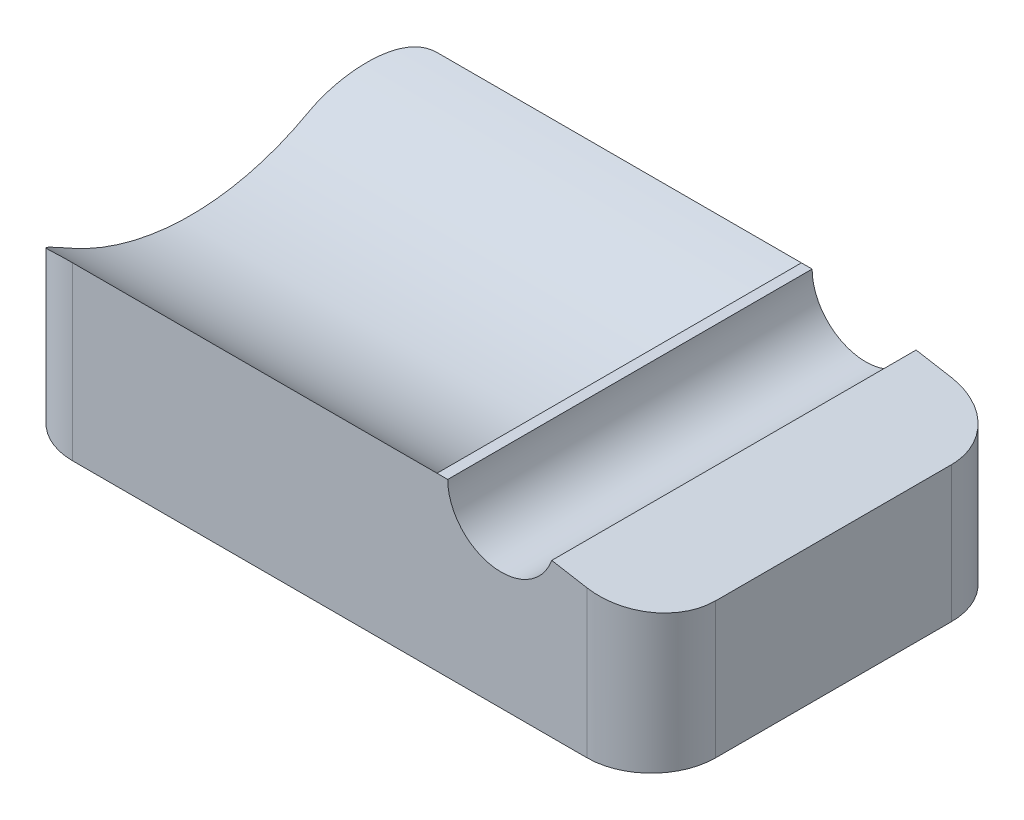
ISO-10303-21;
HEADER;
FILE_DESCRIPTION(('STEP AP214'),'2;1');
FILE_NAME('part.step','',(''),(''),'','','');
FILE_SCHEMA(('AUTOMOTIVE_DESIGN { 1 0 10303 214 1 1 1 1 }'));
ENDSEC;
DATA;
#1=APPLICATION_CONTEXT('core data for automotive mechanical design processes');
#2=APPLICATION_PROTOCOL_DEFINITION('international standard','automotive_design',2000,#1);
#3=PRODUCT_CONTEXT('',#1,'mechanical');
#4=PRODUCT('Part','Part','',(#3));
#5=PRODUCT_RELATED_PRODUCT_CATEGORY('part','',(#4));
#6=PRODUCT_DEFINITION_FORMATION('','',#4);
#7=PRODUCT_DEFINITION_CONTEXT('part definition',#1,'design');
#8=PRODUCT_DEFINITION('design','',#6,#7);
#9=PRODUCT_DEFINITION_SHAPE('','',#8);
#10=(LENGTH_UNIT() NAMED_UNIT(*) SI_UNIT(.MILLI.,.METRE.));
#11=(NAMED_UNIT(*) PLANE_ANGLE_UNIT() SI_UNIT($,.RADIAN.));
#12=(NAMED_UNIT(*) SI_UNIT($,.STERADIAN.) SOLID_ANGLE_UNIT());
#13=UNCERTAINTY_MEASURE_WITH_UNIT(LENGTH_MEASURE(1.E-05),#10,'distance_accuracy_value','');
#14=(GEOMETRIC_REPRESENTATION_CONTEXT(3) GLOBAL_UNCERTAINTY_ASSIGNED_CONTEXT((#13)) GLOBAL_UNIT_ASSIGNED_CONTEXT((#10,
#11,#12)) REPRESENTATION_CONTEXT('',''));
#15=CARTESIAN_POINT('',(0.,0.,0.));
#16=DIRECTION('',(0.,0.,1.));
#17=DIRECTION('',(1.,0.,0.));
#18=AXIS2_PLACEMENT_3D('',#15,#16,#17);
#19=CARTESIAN_POINT('',(0.,0.,0.));
#20=DIRECTION('',(0.,-1.,0.));
#21=DIRECTION('',(0.,0.,-1.));
#22=AXIS2_PLACEMENT_3D('',#19,#20,#21);
#23=PLANE('',#22);
#24=DIRECTION('',(0.,0.,1.));
#25=VECTOR('',#24,1.);
#26=CARTESIAN_POINT('',(0.,0.,0.));
#27=LINE('',#26,#25);
#28=CARTESIAN_POINT('',(0.,0.,-28.));
#29=VERTEX_POINT('',#28);
#30=CARTESIAN_POINT('',(0.,0.,-6.));
#31=VERTEX_POINT('',#30);
#32=EDGE_CURVE('E215',#29,#31,#27,.T.);
#33=ORIENTED_EDGE('',*,*,#32,.F.);
#34=CARTESIAN_POINT('',(6.,0.,-28.));
#35=DIRECTION('',(0.,-1.,0.));
#36=DIRECTION('',(0.,0.,-1.));
#37=AXIS2_PLACEMENT_3D('',#34,#35,#36);
#38=CIRCLE('',#37,6.);
#39=CARTESIAN_POINT('',(6.,0.,-34.));
#40=VERTEX_POINT('',#39);
#41=EDGE_CURVE('E266',#29,#40,#38,.T.);
#42=ORIENTED_EDGE('',*,*,#41,.T.);
#43=DIRECTION('',(-1.,0.,0.));
#44=VECTOR('',#43,1.);
#45=CARTESIAN_POINT('',(0.,0.,-34.));
#46=LINE('',#45,#44);
#47=CARTESIAN_POINT('',(54.,0.,-34.));
#48=VERTEX_POINT('',#47);
#49=EDGE_CURVE('E239',#48,#40,#46,.T.);
#50=ORIENTED_EDGE('',*,*,#49,.F.);
#51=CARTESIAN_POINT('',(54.,0.,-28.));
#52=DIRECTION('',(0.,-1.,0.));
#53=DIRECTION('',(0.,0.,-1.));
#54=AXIS2_PLACEMENT_3D('',#51,#52,#53);
#55=CIRCLE('',#54,6.);
#56=CARTESIAN_POINT('',(60.,0.,-28.));
#57=VERTEX_POINT('',#56);
#58=EDGE_CURVE('E263',#48,#57,#55,.T.);
#59=ORIENTED_EDGE('',*,*,#58,.T.);
#60=DIRECTION('',(0.,0.,-1.));
#61=VECTOR('',#60,1.);
#62=CARTESIAN_POINT('',(60.,0.,0.));
#63=LINE('',#62,#61);
#64=CARTESIAN_POINT('',(60.,0.,-6.));
#65=VERTEX_POINT('',#64);
#66=EDGE_CURVE('E235',#65,#57,#63,.T.);
#67=ORIENTED_EDGE('',*,*,#66,.F.);
#68=CARTESIAN_POINT('',(54.,0.,-6.));
#69=DIRECTION('',(0.,-1.,0.));
#70=DIRECTION('',(0.,0.,-1.));
#71=AXIS2_PLACEMENT_3D('',#68,#69,#70);
#72=CIRCLE('',#71,6.);
#73=CARTESIAN_POINT('',(54.,0.,0.));
#74=VERTEX_POINT('',#73);
#75=EDGE_CURVE('E260',#65,#74,#72,.T.);
#76=ORIENTED_EDGE('',*,*,#75,.T.);
#77=DIRECTION('',(1.,0.,0.));
#78=VECTOR('',#77,1.);
#79=CARTESIAN_POINT('',(0.,0.,0.));
#80=LINE('',#79,#78);
#81=CARTESIAN_POINT('',(6.,0.,0.));
#82=VERTEX_POINT('',#81);
#83=EDGE_CURVE('E231',#82,#74,#80,.T.);
#84=ORIENTED_EDGE('',*,*,#83,.F.);
#85=CARTESIAN_POINT('',(6.,0.,-6.));
#86=DIRECTION('',(0.,-1.,0.));
#87=DIRECTION('',(0.,0.,-1.));
#88=AXIS2_PLACEMENT_3D('',#85,#86,#87);
#89=CIRCLE('',#88,6.);
#90=EDGE_CURVE('E257',#82,#31,#89,.T.);
#91=ORIENTED_EDGE('',*,*,#90,.T.);
#92=EDGE_LOOP('',(#33,#42,#50,#59,#67,#76,#84,#91));
#93=FACE_BOUND('',#92,.T.);
#94=CARTESIAN_POINT('',(14.5,0.,-17.));
#95=DIRECTION('',(0.,-1.,0.));
#96=DIRECTION('',(0.,0.,1.));
#97=AXIS2_PLACEMENT_3D('',#94,#95,#96);
#98=CIRCLE('',#97,6.5);
#99=CARTESIAN_POINT('',(12.,0.,-11.));
#100=VERTEX_POINT('',#99);
#101=CARTESIAN_POINT('',(12.,0.,-23.));
#102=VERTEX_POINT('',#101);
#103=EDGE_CURVE('E521',#100,#102,#98,.T.);
#104=ORIENTED_EDGE('',*,*,#103,.F.);
#105=DIRECTION('',(-1.,0.,0.));
#106=VECTOR('',#105,1.);
#107=CARTESIAN_POINT('',(12.,0.,-11.));
#108=LINE('',#107,#106);
#109=CARTESIAN_POINT('',(13.,0.,-11.));
#110=VERTEX_POINT('',#109);
#111=EDGE_CURVE('E178',#110,#100,#108,.T.);
#112=ORIENTED_EDGE('',*,*,#111,.F.);
#113=DIRECTION('',(0.,0.,1.));
#114=VECTOR('',#113,1.);
#115=CARTESIAN_POINT('',(13.,0.,-11.));
#116=LINE('',#115,#114);
#117=CARTESIAN_POINT('',(13.,0.,-23.));
#118=VERTEX_POINT('',#117);
#119=EDGE_CURVE('E174',#118,#110,#116,.T.);
#120=ORIENTED_EDGE('',*,*,#119,.F.);
#121=DIRECTION('',(1.,0.,0.));
#122=VECTOR('',#121,1.);
#123=CARTESIAN_POINT('',(13.,0.,-23.));
#124=LINE('',#123,#122);
#125=EDGE_CURVE('E517',#102,#118,#124,.T.);
#126=ORIENTED_EDGE('',*,*,#125,.F.);
#127=EDGE_LOOP('',(#104,#112,#120,#126));
#128=FACE_BOUND('',#127,.T.);
#129=ADVANCED_FACE('F45',(#93,#128),#23,.T.);
#130=CARTESIAN_POINT('',(0.,16.,0.));
#131=DIRECTION('',(0.,-1.,0.));
#132=DIRECTION('',(0.,0.,-1.));
#133=AXIS2_PLACEMENT_3D('',#130,#131,#132);
#134=PLANE('',#133);
#135=DIRECTION('',(1.,0.,0.));
#136=VECTOR('',#135,1.);
#137=CARTESIAN_POINT('',(0.,16.,0.));
#138=LINE('',#137,#136);
#139=CARTESIAN_POINT('',(40.,16.,0.));
#140=VERTEX_POINT('',#139);
#141=CARTESIAN_POINT('',(41.,16.,0.));
#142=VERTEX_POINT('',#141);
#143=EDGE_CURVE('E223',#140,#142,#138,.T.);
#144=ORIENTED_EDGE('',*,*,#143,.T.);
#145=DIRECTION('',(0.,0.,1.));
#146=VECTOR('',#145,1.);
#147=CARTESIAN_POINT('',(41.,16.,-34.));
#148=LINE('',#147,#146);
#149=CARTESIAN_POINT('',(41.,16.,-34.));
#150=VERTEX_POINT('',#149);
#151=EDGE_CURVE('E206',#142,#150,#148,.F.);
#152=ORIENTED_EDGE('',*,*,#151,.T.);
#153=DIRECTION('',(-1.,0.,0.));
#154=VECTOR('',#153,1.);
#155=CARTESIAN_POINT('',(0.,16.,-34.));
#156=LINE('',#155,#154);
#157=CARTESIAN_POINT('',(40.,16.,-34.));
#158=VERTEX_POINT('',#157);
#159=EDGE_CURVE('E224',#150,#158,#156,.T.);
#160=ORIENTED_EDGE('',*,*,#159,.T.);
#161=DIRECTION('',(0.,0.,-1.));
#162=VECTOR('',#161,1.);
#163=CARTESIAN_POINT('',(40.,16.,0.));
#164=LINE('',#163,#162);
#165=EDGE_CURVE('E227',#140,#158,#164,.T.);
#166=ORIENTED_EDGE('',*,*,#165,.F.);
#167=EDGE_LOOP('',(#144,#152,#160,#166));
#168=FACE_BOUND('',#167,.T.);
#169=ADVANCED_FACE('F299',(#168),#134,.F.);
#170=CARTESIAN_POINT('',(0.,16.,0.));
#171=DIRECTION('',(1.,0.,0.));
#172=DIRECTION('',(0.,0.,-1.));
#173=AXIS2_PLACEMENT_3D('',#170,#171,#172);
#174=PLANE('',#173);
#175=CARTESIAN_POINT('',(0.,31.,-17.));
#176=DIRECTION('',(-1.,0.,0.));
#177=DIRECTION('',(0.,0.,1.));
#178=AXIS2_PLACEMENT_3D('',#175,#176,#177);
#179=CIRCLE('',#178,22.6715680975093);
#180=CARTESIAN_POINT('',(0.,11.175772398401,-28.));
#181=VERTEX_POINT('',#180);
#182=CARTESIAN_POINT('',(0.,11.175772398401,-6.));
#183=VERTEX_POINT('',#182);
#184=EDGE_CURVE('E210',#181,#183,#179,.T.);
#185=ORIENTED_EDGE('',*,*,#184,.F.);
#186=DIRECTION('',(0.,-1.,0.));
#187=VECTOR('',#186,1.);
#188=CARTESIAN_POINT('',(0.,16.,-28.));
#189=LINE('',#188,#187);
#190=EDGE_CURVE('E253',#181,#29,#189,.T.);
#191=ORIENTED_EDGE('',*,*,#190,.T.);
#192=ORIENTED_EDGE('',*,*,#32,.T.);
#193=DIRECTION('',(0.,-1.,0.));
#194=VECTOR('',#193,1.);
#195=CARTESIAN_POINT('',(0.,16.,-6.));
#196=LINE('',#195,#194);
#197=EDGE_CURVE('E250',#31,#183,#196,.F.);
#198=ORIENTED_EDGE('',*,*,#197,.T.);
#199=EDGE_LOOP('',(#185,#191,#192,#198));
#200=FACE_BOUND('',#199,.T.);
#201=ADVANCED_FACE('F303',(#200),#174,.F.);
#202=CARTESIAN_POINT('',(0.,16.,0.));
#203=DIRECTION('',(0.,0.,-1.));
#204=DIRECTION('',(-1.,0.,0.));
#205=AXIS2_PLACEMENT_3D('',#202,#203,#204);
#206=PLANE('',#205);
#207=DIRECTION('',(0.,-1.,0.));
#208=VECTOR('',#207,1.);
#209=CARTESIAN_POINT('',(54.,16.,0.));
#210=LINE('',#209,#208);
#211=CARTESIAN_POINT('',(54.,13.7371143827351,0.));
#212=VERTEX_POINT('',#211);
#213=EDGE_CURVE('E55',#74,#212,#210,.F.);
#214=ORIENTED_EDGE('',*,*,#213,.T.);
#215=DIRECTION('',(0.985185952673768,-0.171489470972069,0.));
#216=VECTOR('',#215,1.);
#217=CARTESIAN_POINT('',(50.7059136134572,14.3105098216686,0.));
#218=LINE('',#217,#216);
#219=CARTESIAN_POINT('',(50.7059136134572,14.3105098216686,0.));
#220=VERTEX_POINT('',#219);
#221=EDGE_CURVE('E69',#220,#212,#218,.T.);
#222=ORIENTED_EDGE('',*,*,#221,.F.);
#223=CARTESIAN_POINT('',(46.,16.,0.));
#224=DIRECTION('',(0.,0.,1.));
#225=DIRECTION('',(1.,0.,0.));
#226=AXIS2_PLACEMENT_3D('',#223,#224,#225);
#227=CIRCLE('',#226,5.);
#228=EDGE_CURVE('E202',#142,#220,#227,.T.);
#229=ORIENTED_EDGE('',*,*,#228,.F.);
#230=ORIENTED_EDGE('',*,*,#143,.F.);
#231=CARTESIAN_POINT('',(6.,16.,0.));
#232=VERTEX_POINT('',#231);
#233=EDGE_CURVE('E219',#232,#140,#138,.T.);
#234=ORIENTED_EDGE('',*,*,#233,.F.);
#235=DIRECTION('',(0.,-1.,0.));
#236=VECTOR('',#235,1.);
#237=CARTESIAN_POINT('',(6.,16.,0.));
#238=LINE('',#237,#236);
#239=EDGE_CURVE('E348',#232,#82,#238,.T.);
#240=ORIENTED_EDGE('',*,*,#239,.T.);
#241=ORIENTED_EDGE('',*,*,#83,.T.);
#242=EDGE_LOOP('',(#214,#222,#229,#230,#234,#240,#241));
#243=FACE_BOUND('',#242,.T.);
#244=ADVANCED_FACE('F314',(#243),#206,.F.);
#245=CARTESIAN_POINT('',(60.,16.,0.));
#246=DIRECTION('',(-1.,0.,0.));
#247=DIRECTION('',(0.,0.,1.));
#248=AXIS2_PLACEMENT_3D('',#245,#246,#247);
#249=PLANE('',#248);
#250=DIRECTION('',(0.,-1.,0.));
#251=VECTOR('',#250,1.);
#252=CARTESIAN_POINT('',(60.,16.,-28.));
#253=LINE('',#252,#251);
#254=CARTESIAN_POINT('',(60.,12.6927056363051,-28.));
#255=VERTEX_POINT('',#254);
#256=EDGE_CURVE('E350',#57,#255,#253,.F.);
#257=ORIENTED_EDGE('',*,*,#256,.T.);
#258=DIRECTION('',(0.,0.,1.));
#259=VECTOR('',#258,1.);
#260=CARTESIAN_POINT('',(60.,12.6927056363051,-34.));
#261=LINE('',#260,#259);
#262=CARTESIAN_POINT('',(60.,12.6927056363051,-6.));
#263=VERTEX_POINT('',#262);
#264=EDGE_CURVE('E193',#255,#263,#261,.T.);
#265=ORIENTED_EDGE('',*,*,#264,.T.);
#266=DIRECTION('',(0.,-1.,0.));
#267=VECTOR('',#266,1.);
#268=CARTESIAN_POINT('',(60.,16.,-6.));
#269=LINE('',#268,#267);
#270=EDGE_CURVE('E343',#263,#65,#269,.T.);
#271=ORIENTED_EDGE('',*,*,#270,.T.);
#272=ORIENTED_EDGE('',*,*,#66,.T.);
#273=EDGE_LOOP('',(#257,#265,#271,#272));
#274=FACE_BOUND('',#273,.T.);
#275=ADVANCED_FACE('F310',(#274),#249,.F.);
#276=CARTESIAN_POINT('',(0.,16.,-34.));
#277=DIRECTION('',(0.,0.,1.));
#278=DIRECTION('',(1.,0.,0.));
#279=AXIS2_PLACEMENT_3D('',#276,#277,#278);
#280=PLANE('',#279);
#281=CARTESIAN_POINT('',(46.,16.,-34.));
#282=DIRECTION('',(0.,0.,1.));
#283=DIRECTION('',(1.,0.,0.));
#284=AXIS2_PLACEMENT_3D('',#281,#282,#283);
#285=CIRCLE('',#284,5.);
#286=CARTESIAN_POINT('',(50.7059136134572,14.3105098216686,-34.));
#287=VERTEX_POINT('',#286);
#288=EDGE_CURVE('E246',#150,#287,#285,.T.);
#289=ORIENTED_EDGE('',*,*,#288,.T.);
#290=DIRECTION('',(0.985185952673768,-0.171489470972069,0.));
#291=VECTOR('',#290,1.);
#292=CARTESIAN_POINT('',(50.7059136134572,14.3105098216686,-34.));
#293=LINE('',#292,#291);
#294=CARTESIAN_POINT('',(54.,13.7371143827351,-34.));
#295=VERTEX_POINT('',#294);
#296=EDGE_CURVE('E184',#287,#295,#293,.T.);
#297=ORIENTED_EDGE('',*,*,#296,.T.);
#298=DIRECTION('',(0.,-1.,0.));
#299=VECTOR('',#298,1.);
#300=CARTESIAN_POINT('',(54.,16.,-34.));
#301=LINE('',#300,#299);
#302=EDGE_CURVE('E269',#295,#48,#301,.T.);
#303=ORIENTED_EDGE('',*,*,#302,.T.);
#304=ORIENTED_EDGE('',*,*,#49,.T.);
#305=DIRECTION('',(0.,-1.,0.));
#306=VECTOR('',#305,1.);
#307=CARTESIAN_POINT('',(6.,16.,-34.));
#308=LINE('',#307,#306);
#309=CARTESIAN_POINT('',(6.,16.,-34.));
#310=VERTEX_POINT('',#309);
#311=EDGE_CURVE('E272',#40,#310,#308,.F.);
#312=ORIENTED_EDGE('',*,*,#311,.T.);
#313=EDGE_CURVE('E222',#158,#310,#156,.T.);
#314=ORIENTED_EDGE('',*,*,#313,.F.);
#315=ORIENTED_EDGE('',*,*,#159,.F.);
#316=EDGE_LOOP('',(#289,#297,#303,#304,#312,#314,#315));
#317=FACE_BOUND('',#316,.T.);
#318=ADVANCED_FACE('F296',(#317),#280,.F.);
#319=CARTESIAN_POINT('',(40.,31.,-17.));
#320=DIRECTION('',(-1.,0.,0.));
#321=DIRECTION('',(0.,0.,1.));
#322=AXIS2_PLACEMENT_3D('',#319,#320,#321);
#323=CYLINDRICAL_SURFACE('',#322,22.6715680975093);
#324=ORIENTED_EDGE('',*,*,#313,.T.);
#325=CARTESIAN_POINT('',(6.,16.,-34.));
#326=CARTESIAN_POINT('',(5.86571573560258,16.0000633959725,-34.0000397401815));
#327=CARTESIAN_POINT('',(5.73147586727227,15.9948929978959,-33.9954935977073));
#328=CARTESIAN_POINT('',(5.46452664571775,15.9745753379638,-33.9775422921963));
#329=CARTESIAN_POINT('',(5.3318154686466,15.9594415740063,-33.9641491146229));
#330=CARTESIAN_POINT('',(5.07054942474505,15.9199205494336,-33.9290238718144));
#331=CARTESIAN_POINT('',(4.94196396619263,15.895644831738,-33.9073922904469));
#332=CARTESIAN_POINT('',(4.68827934237133,15.8386375021091,-33.8562913688142));
#333=CARTESIAN_POINT('',(4.56318116859032,15.805903511986,-33.8268198241388));
#334=CARTESIAN_POINT('',(4.19562453454559,15.6967773925734,-33.727850429182));
#335=CARTESIAN_POINT('',(3.95928587356342,15.6091972987695,-33.6475691613904));
#336=CARTESIAN_POINT('',(3.50582985372155,15.4114584040024,-33.4625535570982));
#337=CARTESIAN_POINT('',(3.28878466096973,15.3012195528498,-33.3577323367278));
#338=CARTESIAN_POINT('',(2.92304703243994,15.0921734591093,-33.1541701654981));
#339=CARTESIAN_POINT('',(2.77012847270985,14.9965851679524,-33.0595935863696));
#340=CARTESIAN_POINT('',(2.4763544920211,14.7983477182738,-32.8595801528003));
#341=CARTESIAN_POINT('',(2.33550468472562,14.6956953135475,-32.754138294167));
#342=CARTESIAN_POINT('',(2.06563291258675,14.4852008467643,-32.5333420010524));
#343=CARTESIAN_POINT('',(1.93662608133257,14.3773524059198,-32.4179752386656));
#344=CARTESIAN_POINT('',(1.6905208778476,14.1581868320338,-32.1782641692671));
#345=CARTESIAN_POINT('',(1.5734210207504,14.0468701337709,-32.0539209849807));
#346=CARTESIAN_POINT('',(1.34783297045518,13.8187943089033,-31.7931418668431));
#347=CARTESIAN_POINT('',(1.23969534155176,13.7019711259806,-31.6564590765336));
#348=CARTESIAN_POINT('',(1.03603245520975,13.4672048483324,-31.3747947320894));
#349=CARTESIAN_POINT('',(0.940512184889311,13.3492613304113,-31.229809928778));
#350=CARTESIAN_POINT('',(0.76253354689219,13.1135696586602,-30.9323920235388));
#351=CARTESIAN_POINT('',(0.680052350824657,12.9958215286822,-30.7799725643774));
#352=CARTESIAN_POINT('',(0.52833414805697,12.7612659558314,-30.4679868527013));
#353=CARTESIAN_POINT('',(0.459096878929935,12.6444584943634,-30.308420741874));
#354=CARTESIAN_POINT('',(0.332853172377873,12.4098259848725,-29.9787268394822));
#355=CARTESIAN_POINT('',(0.276187336888258,12.2920459351287,-29.8084361742035));
#356=CARTESIAN_POINT('',(0.177982264886445,12.0593134277565,-29.4617015019503));
#357=CARTESIAN_POINT('',(0.136440663041973,11.9443605306042,-29.2852584619011));
#358=CARTESIAN_POINT('',(0.0691443178718792,11.7177749467699,-28.9264771984331));
#359=CARTESIAN_POINT('',(0.0434395170381764,11.6061538094109,-28.7441222150814));
#360=CARTESIAN_POINT('',(0.00886278330985956,11.3873796925902,-28.3750380586712));
#361=CARTESIAN_POINT('',(1.64901016588911E-06,11.2802296225789,-28.1883061571337));
#362=CARTESIAN_POINT('',(0.,11.175772398401,-28.));
#363=B_SPLINE_CURVE_WITH_KNOTS('',3,(#325,#326,#327,#328,#329,#330,#331,#332,#333,#334,#335,
#336,#337,#338,#339,#340,#341,#342,#343,#344,#345,#346,#347,#348,#349,#350,#351,#352,#353,#354,
#355,#356,#357,#358,#359,#360,#361,#362),.UNSPECIFIED.,.F.,.F.,(4,2,2,2,2,2,2,2,2,2,2,2,2,2,2,2,
2,2,4),(0.,0.402604985487127,0.80466566003025,1.20197179315864,1.5993897575693,2.38932785706544,
3.18210620239524,3.79221115472158,4.40259836813399,5.01375501486767,5.62483535322902,
6.25372994642009,6.88287237642946,7.51090082487791,8.13891682772592,8.78229457309508,
9.42557165508125,10.0708671107758,10.7165761306478),.UNSPECIFIED.);
#364=EDGE_CURVE('E283',#310,#181,#363,.T.);
#365=ORIENTED_EDGE('',*,*,#364,.T.);
#366=ORIENTED_EDGE('',*,*,#184,.T.);
#367=CARTESIAN_POINT('',(0.,11.175772398401,-6.));
#368=CARTESIAN_POINT('',(1.49923057500357E-06,11.2380925728507,-5.88768233405292));
#369=CARTESIAN_POINT('',(0.0031539629886887,11.3013572596345,-5.77592136147605));
#370=CARTESIAN_POINT('',(0.0155825729871575,11.4296130111851,-5.55376094923179));
#371=CARTESIAN_POINT('',(0.0248577354396425,11.4946037969945,-5.44336129373216));
#372=CARTESIAN_POINT('',(0.0615739843592031,11.6918038870288,-5.11476918069144));
#373=CARTESIAN_POINT('',(0.0979066505088897,11.8263818434381,-4.89892981372586));
#374=CARTESIAN_POINT('',(0.192751263690002,12.0999662746557,-4.47594008624533));
#375=CARTESIAN_POINT('',(0.251209506536645,12.2389612857585,-4.2687700247817));
#376=CARTESIAN_POINT('',(0.389078916051361,12.5202481847009,-3.86380797898473));
#377=CARTESIAN_POINT('',(0.468493136306184,12.6625405502539,-3.6660173663308));
#378=CARTESIAN_POINT('',(0.637125846124878,12.9325887586845,-3.30277623566147));
#379=CARTESIAN_POINT('',(0.724217097641125,13.0601669189108,-3.13619924871247));
#380=CARTESIAN_POINT('',(0.913552762730476,13.3154458579525,-2.81200874116947));
#381=CARTESIAN_POINT('',(1.01579585377434,13.4431466251005,-2.65439443992667));
#382=CARTESIAN_POINT('',(1.23518180779002,13.6974216289523,-2.34870885773408));
#383=CARTESIAN_POINT('',(1.35233380925269,13.823995123341,-2.2006435144519));
#384=CARTESIAN_POINT('',(1.60135050568307,14.0743760919341,-1.91493053765576));
#385=CARTESIAN_POINT('',(1.73321274751743,14.198184023213,-1.77728117354167));
#386=CARTESIAN_POINT('',(1.98422287550222,14.4171895085708,-1.53936873560997));
#387=CARTESIAN_POINT('',(2.10074048548776,14.513209406234,-1.43709015347687));
#388=CARTESIAN_POINT('',(2.3433566364468,14.7010732739995,-1.24044602531513));
#389=CARTESIAN_POINT('',(2.46945522775162,14.7929172221604,-1.14608052086138));
#390=CARTESIAN_POINT('',(2.86201468720622,15.0599523160426,-0.876154213206851));
#391=CARTESIAN_POINT('',(3.14326760312182,15.2271212496319,-0.713254958382099));
#392=CARTESIAN_POINT('',(3.66302245142628,15.4844111576552,-0.468538630687203));
#393=CARTESIAN_POINT('',(3.89248012506598,15.5831382471218,-0.376710088184819));
#394=CARTESIAN_POINT('',(4.25022280546751,15.7108850302068,-0.259441757774856));
#395=CARTESIAN_POINT('',(4.37159991970079,15.7500472375026,-0.223790517176305));
#396=CARTESIAN_POINT('',(4.61842610390202,15.8206962092841,-0.159839279916933));
#397=CARTESIAN_POINT('',(4.74387273771067,15.8521874731798,-0.131534973252189));
#398=CARTESIAN_POINT('',(4.96238113275337,15.8989609221947,-0.0896686645309584));
#399=CARTESIAN_POINT('',(5.05464263718618,15.9163114710716,-0.0741988593102814));
#400=CARTESIAN_POINT('',(5.2405250729669,15.9463012405227,-0.0475206731777165));
#401=CARTESIAN_POINT('',(5.33414567628877,15.9589415789181,-0.0363112811774221));
#402=CARTESIAN_POINT('',(5.52286016751202,15.9793381687738,-0.0182475580430524));
#403=CARTESIAN_POINT('',(5.61795931306397,15.9870673261059,-0.0114173844535168));
#404=CARTESIAN_POINT('',(5.80870260956778,15.997408227919,-0.00228696219074853));
#405=CARTESIAN_POINT('',(5.90434702852449,16.0000171901265,1.0823622206646E-05));
#406=CARTESIAN_POINT('',(6.,16.,0.));
#407=B_SPLINE_CURVE_WITH_KNOTS('',3,(#367,#368,#369,#370,#371,#372,#373,#374,#375,#376,#377,
#378,#379,#380,#381,#382,#383,#384,#385,#386,#387,#388,#389,#390,#391,#392,#393,#394,#395,#396,
#397,#398,#399,#400,#401,#402,#403,#404,#405,#406),.UNSPECIFIED.,.F.,.F.,(4,2,2,2,2,2,2,2,2,2,2,
2,2,2,2,2,2,2,2,4),(0.,0.385250675703367,0.770439464853539,1.53995017276801,2.30760494528914,
3.07537163795788,3.75623372121593,4.43703641035032,5.11825842915389,5.79936701423134,
6.34599281919563,6.89262149592322,7.98328240504764,8.77863010437171,9.17550061807199,
9.5721377828406,9.85737180750025,10.1425380976127,10.4292642451988,10.7161461544165),.UNSPECIFIED.);
#408=EDGE_CURVE('E275',#183,#232,#407,.T.);
#409=ORIENTED_EDGE('',*,*,#408,.T.);
#410=ORIENTED_EDGE('',*,*,#233,.T.);
#411=CARTESIAN_POINT('',(40.,31.,-17.));
#412=DIRECTION('',(-1.,0.,0.));
#413=DIRECTION('',(0.,0.,1.));
#414=AXIS2_PLACEMENT_3D('',#411,#412,#413);
#415=CIRCLE('',#414,22.6715680975093);
#416=EDGE_CURVE('E211',#158,#140,#415,.T.);
#417=ORIENTED_EDGE('',*,*,#416,.F.);
#418=EDGE_LOOP('',(#324,#365,#366,#409,#410,#417));
#419=FACE_BOUND('',#418,.T.);
#420=ADVANCED_FACE('F290',(#419),#323,.F.);
#421=CARTESIAN_POINT('',(40.,31.,-17.));
#422=DIRECTION('',(-1.,0.,0.));
#423=DIRECTION('',(0.,0.,1.));
#424=AXIS2_PLACEMENT_3D('',#421,#422,#423);
#425=PLANE('',#424);
#426=ORIENTED_EDGE('',*,*,#165,.T.);
#427=ORIENTED_EDGE('',*,*,#416,.T.);
#428=EDGE_LOOP('',(#426,#427));
#429=FACE_BOUND('',#428,.T.);
#430=ADVANCED_FACE('F295',(#429),#425,.T.);
#431=CARTESIAN_POINT('',(46.,16.,-34.));
#432=DIRECTION('',(0.,0.,1.));
#433=DIRECTION('',(1.,0.,0.));
#434=AXIS2_PLACEMENT_3D('',#431,#432,#433);
#435=CYLINDRICAL_SURFACE('',#434,5.);
#436=ORIENTED_EDGE('',*,*,#228,.T.);
#437=DIRECTION('',(0.,0.,1.));
#438=VECTOR('',#437,1.);
#439=CARTESIAN_POINT('',(50.7059136134572,14.3105098216686,-34.));
#440=LINE('',#439,#438);
#441=EDGE_CURVE('E191',#287,#220,#440,.T.);
#442=ORIENTED_EDGE('',*,*,#441,.F.);
#443=ORIENTED_EDGE('',*,*,#288,.F.);
#444=ORIENTED_EDGE('',*,*,#151,.F.);
#445=EDGE_LOOP('',(#436,#442,#443,#444));
#446=FACE_BOUND('',#445,.T.);
#447=ADVANCED_FACE('F326',(#446),#435,.F.);
#448=CARTESIAN_POINT('',(6.,16.,-28.));
#449=DIRECTION('',(0.,-1.,0.));
#450=DIRECTION('',(0.,0.,-1.));
#451=AXIS2_PLACEMENT_3D('',#448,#449,#450);
#452=CYLINDRICAL_SURFACE('',#451,6.);
#453=ORIENTED_EDGE('',*,*,#364,.F.);
#454=ORIENTED_EDGE('',*,*,#311,.F.);
#455=ORIENTED_EDGE('',*,*,#41,.F.);
#456=ORIENTED_EDGE('',*,*,#190,.F.);
#457=EDGE_LOOP('',(#453,#454,#455,#456));
#458=FACE_BOUND('',#457,.T.);
#459=ADVANCED_FACE('F321',(#458),#452,.T.);
#460=CARTESIAN_POINT('',(54.,16.,-28.));
#461=DIRECTION('',(0.,-1.,0.));
#462=DIRECTION('',(0.,0.,-1.));
#463=AXIS2_PLACEMENT_3D('',#460,#461,#462);
#464=CYLINDRICAL_SURFACE('',#463,6.);
#465=CARTESIAN_POINT('',(54.,13.7371143827351,-28.));
#466=DIRECTION('',(-0.171489470972069,-0.985185952673768,0.));
#467=DIRECTION('',(0.985185952673768,-0.171489470972069,0.));
#468=AXIS2_PLACEMENT_3D('',#465,#466,#467);
#469=ELLIPSE('',#468,6.09022081944648,6.);
#470=EDGE_CURVE('E197',#255,#295,#469,.F.);
#471=ORIENTED_EDGE('',*,*,#470,.F.);
#472=ORIENTED_EDGE('',*,*,#256,.F.);
#473=ORIENTED_EDGE('',*,*,#58,.F.);
#474=ORIENTED_EDGE('',*,*,#302,.F.);
#475=EDGE_LOOP('',(#471,#472,#473,#474));
#476=FACE_BOUND('',#475,.T.);
#477=ADVANCED_FACE('F325',(#476),#464,.T.);
#478=CARTESIAN_POINT('',(54.,16.,-6.));
#479=DIRECTION('',(0.,-1.,0.));
#480=DIRECTION('',(0.,0.,-1.));
#481=AXIS2_PLACEMENT_3D('',#478,#479,#480);
#482=CYLINDRICAL_SURFACE('',#481,6.);
#483=CARTESIAN_POINT('',(54.,13.7371143827351,-6.));
#484=DIRECTION('',(-0.171489470972069,-0.985185952673768,0.));
#485=DIRECTION('',(0.985185952673768,-0.171489470972069,0.));
#486=AXIS2_PLACEMENT_3D('',#483,#484,#485);
#487=ELLIPSE('',#486,6.09022081944648,6.);
#488=EDGE_CURVE('E11',#212,#263,#487,.F.);
#489=ORIENTED_EDGE('',*,*,#488,.F.);
#490=ORIENTED_EDGE('',*,*,#213,.F.);
#491=ORIENTED_EDGE('',*,*,#75,.F.);
#492=ORIENTED_EDGE('',*,*,#270,.F.);
#493=EDGE_LOOP('',(#489,#490,#491,#492));
#494=FACE_BOUND('',#493,.T.);
#495=ADVANCED_FACE('F329',(#494),#482,.T.);
#496=CARTESIAN_POINT('',(6.,16.,-6.));
#497=DIRECTION('',(0.,-1.,0.));
#498=DIRECTION('',(0.,0.,-1.));
#499=AXIS2_PLACEMENT_3D('',#496,#497,#498);
#500=CYLINDRICAL_SURFACE('',#499,6.);
#501=ORIENTED_EDGE('',*,*,#408,.F.);
#502=ORIENTED_EDGE('',*,*,#197,.F.);
#503=ORIENTED_EDGE('',*,*,#90,.F.);
#504=ORIENTED_EDGE('',*,*,#239,.F.);
#505=EDGE_LOOP('',(#501,#502,#503,#504));
#506=FACE_BOUND('',#505,.T.);
#507=ADVANCED_FACE('F47',(#506),#500,.T.);
#508=CARTESIAN_POINT('',(50.7059136134572,14.3105098216686,-34.));
#509=DIRECTION('',(-0.171489470972069,-0.985185952673768,0.));
#510=DIRECTION('',(0.985185952673768,-0.171489470972069,0.));
#511=AXIS2_PLACEMENT_3D('',#508,#509,#510);
#512=PLANE('',#511);
#513=ORIENTED_EDGE('',*,*,#470,.T.);
#514=ORIENTED_EDGE('',*,*,#296,.F.);
#515=ORIENTED_EDGE('',*,*,#441,.T.);
#516=ORIENTED_EDGE('',*,*,#221,.T.);
#517=ORIENTED_EDGE('',*,*,#488,.T.);
#518=ORIENTED_EDGE('',*,*,#264,.F.);
#519=EDGE_LOOP('',(#513,#514,#515,#516,#517,#518));
#520=FACE_BOUND('',#519,.T.);
#521=ADVANCED_FACE('F337',(#520),#512,.F.);
#522=CARTESIAN_POINT('',(12.,-1.,-11.));
#523=DIRECTION('',(0.,0.,-1.));
#524=DIRECTION('',(-1.,0.,0.));
#525=AXIS2_PLACEMENT_3D('',#522,#523,#524);
#526=PLANE('',#525);
#527=ORIENTED_EDGE('',*,*,#111,.T.);
#528=DIRECTION('',(0.,1.,0.));
#529=VECTOR('',#528,1.);
#530=CARTESIAN_POINT('',(12.,-1.,-11.));
#531=LINE('',#530,#529);
#532=CARTESIAN_POINT('',(12.,-1.,-11.));
#533=VERTEX_POINT('',#532);
#534=EDGE_CURVE('E157',#533,#100,#531,.T.);
#535=ORIENTED_EDGE('',*,*,#534,.F.);
#536=DIRECTION('',(-1.,0.,0.));
#537=VECTOR('',#536,1.);
#538=CARTESIAN_POINT('',(12.,-1.,-11.));
#539=LINE('',#538,#537);
#540=CARTESIAN_POINT('',(13.,-1.,-11.));
#541=VERTEX_POINT('',#540);
#542=EDGE_CURVE('E165',#541,#533,#539,.T.);
#543=ORIENTED_EDGE('',*,*,#542,.F.);
#544=DIRECTION('',(0.,1.,0.));
#545=VECTOR('',#544,1.);
#546=CARTESIAN_POINT('',(13.,-1.,-11.));
#547=LINE('',#546,#545);
#548=EDGE_CURVE('E514',#541,#110,#547,.T.);
#549=ORIENTED_EDGE('',*,*,#548,.T.);
#550=EDGE_LOOP('',(#527,#535,#543,#549));
#551=FACE_BOUND('',#550,.T.);
#552=ADVANCED_FACE('F176',(#551),#526,.F.);
#553=CARTESIAN_POINT('',(14.5,-1.,-17.));
#554=DIRECTION('',(0.,1.,0.));
#555=DIRECTION('',(0.,0.,1.));
#556=AXIS2_PLACEMENT_3D('',#553,#554,#555);
#557=CYLINDRICAL_SURFACE('',#556,6.5);
#558=ORIENTED_EDGE('',*,*,#103,.T.);
#559=DIRECTION('',(0.,1.,0.));
#560=VECTOR('',#559,1.);
#561=CARTESIAN_POINT('',(12.,-1.,-23.));
#562=LINE('',#561,#560);
#563=CARTESIAN_POINT('',(12.,-1.,-23.));
#564=VERTEX_POINT('',#563);
#565=EDGE_CURVE('E160',#564,#102,#562,.T.);
#566=ORIENTED_EDGE('',*,*,#565,.F.);
#567=CARTESIAN_POINT('',(14.5,-1.,-17.));
#568=DIRECTION('',(0.,-1.,0.));
#569=DIRECTION('',(0.,0.,1.));
#570=AXIS2_PLACEMENT_3D('',#567,#568,#569);
#571=CIRCLE('',#570,6.5);
#572=EDGE_CURVE('E153',#533,#564,#571,.T.);
#573=ORIENTED_EDGE('',*,*,#572,.F.);
#574=ORIENTED_EDGE('',*,*,#534,.T.);
#575=EDGE_LOOP('',(#558,#566,#573,#574));
#576=FACE_BOUND('',#575,.T.);
#577=ADVANCED_FACE('F155',(#576),#557,.T.);
#578=CARTESIAN_POINT('',(13.,-1.,-23.));
#579=DIRECTION('',(0.,0.,1.));
#580=DIRECTION('',(1.,0.,0.));
#581=AXIS2_PLACEMENT_3D('',#578,#579,#580);
#582=PLANE('',#581);
#583=ORIENTED_EDGE('',*,*,#125,.T.);
#584=DIRECTION('',(0.,1.,0.));
#585=VECTOR('',#584,1.);
#586=CARTESIAN_POINT('',(13.,-1.,-23.));
#587=LINE('',#586,#585);
#588=CARTESIAN_POINT('',(13.,-1.,-23.));
#589=VERTEX_POINT('',#588);
#590=EDGE_CURVE('E62',#589,#118,#587,.T.);
#591=ORIENTED_EDGE('',*,*,#590,.F.);
#592=DIRECTION('',(1.,0.,0.));
#593=VECTOR('',#592,1.);
#594=CARTESIAN_POINT('',(13.,-1.,-23.));
#595=LINE('',#594,#593);
#596=EDGE_CURVE('E164',#564,#589,#595,.T.);
#597=ORIENTED_EDGE('',*,*,#596,.F.);
#598=ORIENTED_EDGE('',*,*,#565,.T.);
#599=EDGE_LOOP('',(#583,#591,#597,#598));
#600=FACE_BOUND('',#599,.T.);
#601=ADVANCED_FACE('F397',(#600),#582,.F.);
#602=CARTESIAN_POINT('',(13.,-1.,-11.));
#603=DIRECTION('',(-1.,0.,0.));
#604=DIRECTION('',(0.,0.,1.));
#605=AXIS2_PLACEMENT_3D('',#602,#603,#604);
#606=PLANE('',#605);
#607=ORIENTED_EDGE('',*,*,#119,.T.);
#608=ORIENTED_EDGE('',*,*,#548,.F.);
#609=DIRECTION('',(0.,0.,1.));
#610=VECTOR('',#609,1.);
#611=CARTESIAN_POINT('',(13.,-1.,-11.));
#612=LINE('',#611,#610);
#613=EDGE_CURVE('E169',#589,#541,#612,.T.);
#614=ORIENTED_EDGE('',*,*,#613,.F.);
#615=ORIENTED_EDGE('',*,*,#590,.T.);
#616=EDGE_LOOP('',(#607,#608,#614,#615));
#617=FACE_BOUND('',#616,.T.);
#618=ADVANCED_FACE('F400',(#617),#606,.F.);
#619=CARTESIAN_POINT('',(14.5,-1.,-17.));
#620=DIRECTION('',(0.,1.,0.));
#621=DIRECTION('',(0.,0.,1.));
#622=AXIS2_PLACEMENT_3D('',#619,#620,#621);
#623=PLANE('',#622);
#624=ORIENTED_EDGE('',*,*,#542,.T.);
#625=ORIENTED_EDGE('',*,*,#572,.T.);
#626=ORIENTED_EDGE('',*,*,#596,.T.);
#627=ORIENTED_EDGE('',*,*,#613,.T.);
#628=EDGE_LOOP('',(#624,#625,#626,#627));
#629=FACE_BOUND('',#628,.T.);
#630=ADVANCED_FACE('F168',(#629),#623,.F.);
#631=CLOSED_SHELL('',(#129,#169,#201,#244,#275,#318,#420,#430,#447,#459,#477,#495,#507,#521,
#552,#577,#601,#618,#630));
#632=MANIFOLD_SOLID_BREP('B2',#631);
#633=ADVANCED_BREP_SHAPE_REPRESENTATION('',(#18,#632),#14);
#634=SHAPE_DEFINITION_REPRESENTATION(#9,#633);
ENDSEC;
END-ISO-10303-21;
